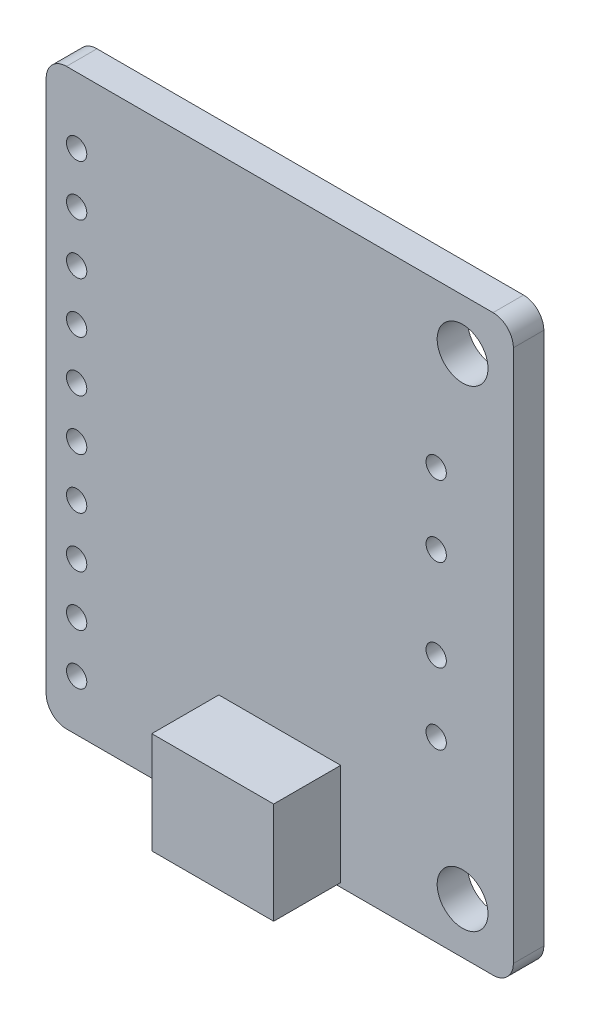
ISO-10303-21;
HEADER;
FILE_DESCRIPTION(('STEP AP214'),'2;1');
FILE_NAME('part.step','',(''),(''),'','','');
FILE_SCHEMA(('AUTOMOTIVE_DESIGN { 1 0 10303 214 1 1 1 1 }'));
ENDSEC;
DATA;
#1=APPLICATION_CONTEXT('core data for automotive mechanical design processes');
#2=APPLICATION_PROTOCOL_DEFINITION('international standard','automotive_design',2000,#1);
#3=PRODUCT_CONTEXT('',#1,'mechanical');
#4=PRODUCT('Part','Part','',(#3));
#5=PRODUCT_RELATED_PRODUCT_CATEGORY('part','',(#4));
#6=PRODUCT_DEFINITION_FORMATION('','',#4);
#7=PRODUCT_DEFINITION_CONTEXT('part definition',#1,'design');
#8=PRODUCT_DEFINITION('design','',#6,#7);
#9=PRODUCT_DEFINITION_SHAPE('','',#8);
#10=(LENGTH_UNIT() NAMED_UNIT(*) SI_UNIT(.MILLI.,.METRE.));
#11=(NAMED_UNIT(*) PLANE_ANGLE_UNIT() SI_UNIT($,.RADIAN.));
#12=(NAMED_UNIT(*) SI_UNIT($,.STERADIAN.) SOLID_ANGLE_UNIT());
#13=UNCERTAINTY_MEASURE_WITH_UNIT(LENGTH_MEASURE(1.E-05),#10,'distance_accuracy_value','');
#14=(GEOMETRIC_REPRESENTATION_CONTEXT(3) GLOBAL_UNCERTAINTY_ASSIGNED_CONTEXT((#13)) GLOBAL_UNIT_ASSIGNED_CONTEXT((#10,
#11,#12)) REPRESENTATION_CONTEXT('',''));
#15=CARTESIAN_POINT('',(0.,0.,0.));
#16=DIRECTION('',(0.,0.,1.));
#17=DIRECTION('',(1.,0.,0.));
#18=AXIS2_PLACEMENT_3D('',#15,#16,#17);
#19=CARTESIAN_POINT('',(-10.5,-13.125,1.5));
#20=DIRECTION('',(0.,0.,-1.));
#21=DIRECTION('',(-1.,0.,0.));
#22=AXIS2_PLACEMENT_3D('',#19,#20,#21);
#23=PLANE('',#22);
#24=CARTESIAN_POINT('',(7.7,2.625,1.5));
#25=DIRECTION('',(0.,0.,1.));
#26=DIRECTION('',(1.,0.,0.));
#27=AXIS2_PLACEMENT_3D('',#24,#25,#26);
#28=CIRCLE('',#27,0.500000000000001);
#29=CARTESIAN_POINT('',(8.2,2.625,1.5));
#30=VERTEX_POINT('',#29);
#31=EDGE_CURVE('E342',#30,#30,#28,.T.);
#32=ORIENTED_EDGE('',*,*,#31,.F.);
#33=EDGE_LOOP('',(#32));
#34=FACE_BOUND('',#33,.T.);
#35=CARTESIAN_POINT('',(7.7,-5.375,1.5));
#36=DIRECTION('',(0.,0.,1.));
#37=DIRECTION('',(1.,0.,0.));
#38=AXIS2_PLACEMENT_3D('',#35,#36,#37);
#39=CIRCLE('',#38,0.500000000000001);
#40=CARTESIAN_POINT('',(8.2,-5.375,1.5));
#41=VERTEX_POINT('',#40);
#42=EDGE_CURVE('E336',#41,#41,#39,.T.);
#43=ORIENTED_EDGE('',*,*,#42,.F.);
#44=EDGE_LOOP('',(#43));
#45=FACE_BOUND('',#44,.T.);
#46=CARTESIAN_POINT('',(7.7,-1.875,1.5));
#47=DIRECTION('',(0.,0.,1.));
#48=DIRECTION('',(1.,0.,0.));
#49=AXIS2_PLACEMENT_3D('',#46,#47,#48);
#50=CIRCLE('',#49,0.500000000000001);
#51=CARTESIAN_POINT('',(8.2,-1.875,1.5));
#52=VERTEX_POINT('',#51);
#53=EDGE_CURVE('E330',#52,#52,#50,.T.);
#54=ORIENTED_EDGE('',*,*,#53,.F.);
#55=EDGE_LOOP('',(#54));
#56=FACE_BOUND('',#55,.T.);
#57=CARTESIAN_POINT('',(7.7,6.125,1.5));
#58=DIRECTION('',(0.,0.,1.));
#59=DIRECTION('',(1.,0.,0.));
#60=AXIS2_PLACEMENT_3D('',#57,#58,#59);
#61=CIRCLE('',#60,0.500000000000001);
#62=CARTESIAN_POINT('',(8.2,6.125,1.5));
#63=VERTEX_POINT('',#62);
#64=EDGE_CURVE('E324',#63,#63,#61,.T.);
#65=ORIENTED_EDGE('',*,*,#64,.F.);
#66=EDGE_LOOP('',(#65));
#67=FACE_BOUND('',#66,.T.);
#68=CARTESIAN_POINT('',(-10.,10.875,1.5));
#69=DIRECTION('',(0.,0.,1.));
#70=DIRECTION('',(1.,0.,0.));
#71=AXIS2_PLACEMENT_3D('',#68,#69,#70);
#72=CIRCLE('',#71,0.500000000000001);
#73=CARTESIAN_POINT('',(-9.5,10.875,1.5));
#74=VERTEX_POINT('',#73);
#75=EDGE_CURVE('E11',#74,#74,#72,.T.);
#76=ORIENTED_EDGE('',*,*,#75,.F.);
#77=EDGE_LOOP('',(#76));
#78=FACE_BOUND('',#77,.T.);
#79=CARTESIAN_POINT('',(-10.,8.375,1.5));
#80=DIRECTION('',(0.,0.,1.));
#81=DIRECTION('',(1.,0.,0.));
#82=AXIS2_PLACEMENT_3D('',#79,#80,#81);
#83=CIRCLE('',#82,0.500000000000001);
#84=CARTESIAN_POINT('',(-9.5,8.375,1.5));
#85=VERTEX_POINT('',#84);
#86=EDGE_CURVE('E269',#85,#85,#83,.T.);
#87=ORIENTED_EDGE('',*,*,#86,.F.);
#88=EDGE_LOOP('',(#87));
#89=FACE_BOUND('',#88,.T.);
#90=CARTESIAN_POINT('',(-10.,5.875,1.5));
#91=DIRECTION('',(0.,0.,1.));
#92=DIRECTION('',(1.,0.,0.));
#93=AXIS2_PLACEMENT_3D('',#90,#91,#92);
#94=CIRCLE('',#93,0.500000000000001);
#95=CARTESIAN_POINT('',(-9.5,5.875,1.5));
#96=VERTEX_POINT('',#95);
#97=EDGE_CURVE('E263',#96,#96,#94,.T.);
#98=ORIENTED_EDGE('',*,*,#97,.F.);
#99=EDGE_LOOP('',(#98));
#100=FACE_BOUND('',#99,.T.);
#101=CARTESIAN_POINT('',(-10.,3.375,1.5));
#102=DIRECTION('',(0.,0.,1.));
#103=DIRECTION('',(1.,0.,0.));
#104=AXIS2_PLACEMENT_3D('',#101,#102,#103);
#105=CIRCLE('',#104,0.500000000000001);
#106=CARTESIAN_POINT('',(-9.5,3.375,1.5));
#107=VERTEX_POINT('',#106);
#108=EDGE_CURVE('E257',#107,#107,#105,.T.);
#109=ORIENTED_EDGE('',*,*,#108,.F.);
#110=EDGE_LOOP('',(#109));
#111=FACE_BOUND('',#110,.T.);
#112=CARTESIAN_POINT('',(-10.,0.875000000000001,1.5));
#113=DIRECTION('',(0.,0.,1.));
#114=DIRECTION('',(1.,0.,0.));
#115=AXIS2_PLACEMENT_3D('',#112,#113,#114);
#116=CIRCLE('',#115,0.500000000000001);
#117=CARTESIAN_POINT('',(-9.5,0.875000000000001,1.5));
#118=VERTEX_POINT('',#117);
#119=EDGE_CURVE('E251',#118,#118,#116,.T.);
#120=ORIENTED_EDGE('',*,*,#119,.F.);
#121=EDGE_LOOP('',(#120));
#122=FACE_BOUND('',#121,.T.);
#123=CARTESIAN_POINT('',(-10.,-1.625,1.5));
#124=DIRECTION('',(0.,0.,1.));
#125=DIRECTION('',(1.,0.,0.));
#126=AXIS2_PLACEMENT_3D('',#123,#124,#125);
#127=CIRCLE('',#126,0.500000000000001);
#128=CARTESIAN_POINT('',(-9.5,-1.625,1.5));
#129=VERTEX_POINT('',#128);
#130=EDGE_CURVE('E245',#129,#129,#127,.T.);
#131=ORIENTED_EDGE('',*,*,#130,.F.);
#132=EDGE_LOOP('',(#131));
#133=FACE_BOUND('',#132,.T.);
#134=CARTESIAN_POINT('',(-10.,-4.125,1.5));
#135=DIRECTION('',(0.,0.,1.));
#136=DIRECTION('',(1.,0.,0.));
#137=AXIS2_PLACEMENT_3D('',#134,#135,#136);
#138=CIRCLE('',#137,0.500000000000001);
#139=CARTESIAN_POINT('',(-9.5,-4.125,1.5));
#140=VERTEX_POINT('',#139);
#141=EDGE_CURVE('E239',#140,#140,#138,.T.);
#142=ORIENTED_EDGE('',*,*,#141,.F.);
#143=EDGE_LOOP('',(#142));
#144=FACE_BOUND('',#143,.T.);
#145=CARTESIAN_POINT('',(-10.,-6.625,1.5));
#146=DIRECTION('',(0.,0.,1.));
#147=DIRECTION('',(1.,0.,0.));
#148=AXIS2_PLACEMENT_3D('',#145,#146,#147);
#149=CIRCLE('',#148,0.500000000000001);
#150=CARTESIAN_POINT('',(-9.5,-6.625,1.5));
#151=VERTEX_POINT('',#150);
#152=EDGE_CURVE('E233',#151,#151,#149,.T.);
#153=ORIENTED_EDGE('',*,*,#152,.F.);
#154=EDGE_LOOP('',(#153));
#155=FACE_BOUND('',#154,.T.);
#156=CARTESIAN_POINT('',(-10.5,-13.125,1.5));
#157=DIRECTION('',(0.,0.,1.));
#158=DIRECTION('',(-1.,0.,0.));
#159=AXIS2_PLACEMENT_3D('',#156,#157,#158);
#160=CIRCLE('',#159,1.);
#161=CARTESIAN_POINT('',(-11.5,-13.125,1.5));
#162=VERTEX_POINT('',#161);
#163=CARTESIAN_POINT('',(-10.5,-14.125,1.5));
#164=VERTEX_POINT('',#163);
#165=EDGE_CURVE('E173',#162,#164,#160,.T.);
#166=ORIENTED_EDGE('',*,*,#165,.T.);
#167=DIRECTION('',(1.,0.,0.));
#168=VECTOR('',#167,1.);
#169=CARTESIAN_POINT('',(-10.5,-14.125,1.5));
#170=LINE('',#169,#168);
#171=CARTESIAN_POINT('',(10.5,-14.125,1.5));
#172=VERTEX_POINT('',#171);
#173=EDGE_CURVE('E176',#164,#172,#170,.T.);
#174=ORIENTED_EDGE('',*,*,#173,.T.);
#175=CARTESIAN_POINT('',(10.5,-13.125,1.5));
#176=DIRECTION('',(0.,0.,1.));
#177=DIRECTION('',(1.,0.,0.));
#178=AXIS2_PLACEMENT_3D('',#175,#176,#177);
#179=CIRCLE('',#178,1.);
#180=CARTESIAN_POINT('',(11.5,-13.125,1.5));
#181=VERTEX_POINT('',#180);
#182=EDGE_CURVE('E179',#172,#181,#179,.T.);
#183=ORIENTED_EDGE('',*,*,#182,.T.);
#184=DIRECTION('',(0.,1.,0.));
#185=VECTOR('',#184,1.);
#186=CARTESIAN_POINT('',(11.5,-13.125,1.5));
#187=LINE('',#186,#185);
#188=CARTESIAN_POINT('',(11.5,13.125,1.5));
#189=VERTEX_POINT('',#188);
#190=EDGE_CURVE('E181',#181,#189,#187,.T.);
#191=ORIENTED_EDGE('',*,*,#190,.T.);
#192=CARTESIAN_POINT('',(10.5,13.125,1.5));
#193=DIRECTION('',(0.,0.,1.));
#194=DIRECTION('',(-1.,0.,0.));
#195=AXIS2_PLACEMENT_3D('',#192,#193,#194);
#196=CIRCLE('',#195,1.);
#197=CARTESIAN_POINT('',(10.5,14.125,1.5));
#198=VERTEX_POINT('',#197);
#199=EDGE_CURVE('E183',#189,#198,#196,.T.);
#200=ORIENTED_EDGE('',*,*,#199,.T.);
#201=DIRECTION('',(-1.,0.,0.));
#202=VECTOR('',#201,1.);
#203=CARTESIAN_POINT('',(-10.5,14.125,1.5));
#204=LINE('',#203,#202);
#205=CARTESIAN_POINT('',(-10.5,14.125,1.5));
#206=VERTEX_POINT('',#205);
#207=EDGE_CURVE('E185',#198,#206,#204,.T.);
#208=ORIENTED_EDGE('',*,*,#207,.T.);
#209=CARTESIAN_POINT('',(-10.5,13.125,1.5));
#210=DIRECTION('',(0.,0.,1.));
#211=DIRECTION('',(-1.,0.,0.));
#212=AXIS2_PLACEMENT_3D('',#209,#210,#211);
#213=CIRCLE('',#212,1.);
#214=CARTESIAN_POINT('',(-11.5,13.125,1.5));
#215=VERTEX_POINT('',#214);
#216=EDGE_CURVE('E187',#206,#215,#213,.T.);
#217=ORIENTED_EDGE('',*,*,#216,.T.);
#218=DIRECTION('',(0.,-1.,0.));
#219=VECTOR('',#218,1.);
#220=CARTESIAN_POINT('',(-11.5,-13.125,1.5));
#221=LINE('',#220,#219);
#222=EDGE_CURVE('E189',#215,#162,#221,.T.);
#223=ORIENTED_EDGE('',*,*,#222,.T.);
#224=EDGE_LOOP('',(#166,#174,#183,#191,#200,#208,#217,#223));
#225=FACE_BOUND('',#224,.T.);
#226=CARTESIAN_POINT('',(9.,11.625,1.5));
#227=DIRECTION('',(0.,0.,1.));
#228=DIRECTION('',(1.,0.,0.));
#229=AXIS2_PLACEMENT_3D('',#226,#227,#228);
#230=CIRCLE('',#229,1.25);
#231=CARTESIAN_POINT('',(10.25,11.625,1.5));
#232=VERTEX_POINT('',#231);
#233=EDGE_CURVE('E164',#232,#232,#230,.T.);
#234=ORIENTED_EDGE('',*,*,#233,.F.);
#235=EDGE_LOOP('',(#234));
#236=FACE_BOUND('',#235,.T.);
#237=CARTESIAN_POINT('',(9.,-11.625,1.5));
#238=DIRECTION('',(0.,0.,-1.));
#239=DIRECTION('',(1.,0.,0.));
#240=AXIS2_PLACEMENT_3D('',#237,#238,#239);
#241=CIRCLE('',#240,1.25);
#242=CARTESIAN_POINT('',(10.25,-11.625,1.5));
#243=VERTEX_POINT('',#242);
#244=EDGE_CURVE('E158',#243,#243,#241,.T.);
#245=ORIENTED_EDGE('',*,*,#244,.T.);
#246=EDGE_LOOP('',(#245));
#247=FACE_BOUND('',#246,.T.);
#248=CARTESIAN_POINT('',(-10.,-11.625,1.5));
#249=DIRECTION('',(0.,0.,1.));
#250=DIRECTION('',(1.,0.,0.));
#251=AXIS2_PLACEMENT_3D('',#248,#249,#250);
#252=CIRCLE('',#251,0.500000000000001);
#253=CARTESIAN_POINT('',(-9.5,-11.625,1.5));
#254=VERTEX_POINT('',#253);
#255=EDGE_CURVE('E154',#254,#254,#252,.T.);
#256=ORIENTED_EDGE('',*,*,#255,.F.);
#257=EDGE_LOOP('',(#256));
#258=FACE_BOUND('',#257,.T.);
#259=CARTESIAN_POINT('',(-10.,-9.125,1.5));
#260=DIRECTION('',(0.,0.,1.));
#261=DIRECTION('',(1.,0.,0.));
#262=AXIS2_PLACEMENT_3D('',#259,#260,#261);
#263=CIRCLE('',#262,0.500000000000001);
#264=CARTESIAN_POINT('',(-9.5,-9.125,1.5));
#265=VERTEX_POINT('',#264);
#266=EDGE_CURVE('E146',#265,#265,#263,.T.);
#267=ORIENTED_EDGE('',*,*,#266,.F.);
#268=EDGE_LOOP('',(#267));
#269=FACE_BOUND('',#268,.T.);
#270=DIRECTION('',(0.,1.,0.));
#271=VECTOR('',#270,1.);
#272=CARTESIAN_POINT('',(3.,-8.925,1.5));
#273=LINE('',#272,#271);
#274=CARTESIAN_POINT('',(3.,-13.925,1.5));
#275=VERTEX_POINT('',#274);
#276=CARTESIAN_POINT('',(3.,-8.925,1.5));
#277=VERTEX_POINT('',#276);
#278=EDGE_CURVE('E142',#275,#277,#273,.T.);
#279=ORIENTED_EDGE('',*,*,#278,.F.);
#280=DIRECTION('',(1.,0.,0.));
#281=VECTOR('',#280,1.);
#282=CARTESIAN_POINT('',(-3.,-13.925,1.5));
#283=LINE('',#282,#281);
#284=CARTESIAN_POINT('',(-3.,-13.925,1.5));
#285=VERTEX_POINT('',#284);
#286=EDGE_CURVE('E139',#285,#275,#283,.T.);
#287=ORIENTED_EDGE('',*,*,#286,.F.);
#288=DIRECTION('',(0.,-1.,0.));
#289=VECTOR('',#288,1.);
#290=CARTESIAN_POINT('',(-3.,-8.925,1.5));
#291=LINE('',#290,#289);
#292=CARTESIAN_POINT('',(-3.,-8.925,1.5));
#293=VERTEX_POINT('',#292);
#294=EDGE_CURVE('E53',#293,#285,#291,.T.);
#295=ORIENTED_EDGE('',*,*,#294,.F.);
#296=DIRECTION('',(-1.,0.,0.));
#297=VECTOR('',#296,1.);
#298=CARTESIAN_POINT('',(-3.,-8.925,1.5));
#299=LINE('',#298,#297);
#300=EDGE_CURVE('E48',#277,#293,#299,.T.);
#301=ORIENTED_EDGE('',*,*,#300,.F.);
#302=EDGE_LOOP('',(#279,#287,#295,#301));
#303=FACE_BOUND('',#302,.T.);
#304=ADVANCED_FACE('F33',(#34,#45,#56,#67,#78,#89,#100,#111,#122,#133,#144,#155,#225,#236,#247,
#258,#269,#303),#23,.F.);
#305=CARTESIAN_POINT('',(-10.,10.875,0.));
#306=DIRECTION('',(0.,0.,1.));
#307=DIRECTION('',(1.,0.,0.));
#308=AXIS2_PLACEMENT_3D('',#305,#306,#307);
#309=CYLINDRICAL_SURFACE('',#308,0.500000000000001);
#310=CARTESIAN_POINT('',(-10.,10.875,0.));
#311=DIRECTION('',(0.,0.,1.));
#312=DIRECTION('',(1.,0.,0.));
#313=AXIS2_PLACEMENT_3D('',#310,#311,#312);
#314=CIRCLE('',#313,0.500000000000001);
#315=CARTESIAN_POINT('',(-9.5,10.875,0.));
#316=VERTEX_POINT('',#315);
#317=EDGE_CURVE('E41',#316,#316,#314,.T.);
#318=ORIENTED_EDGE('',*,*,#317,.F.);
#319=EDGE_LOOP('',(#318));
#320=FACE_BOUND('',#319,.T.);
#321=ORIENTED_EDGE('',*,*,#75,.T.);
#322=EDGE_LOOP('',(#321));
#323=FACE_BOUND('',#322,.T.);
#324=ADVANCED_FACE('F35',(#320,#323),#309,.F.);
#325=CARTESIAN_POINT('',(-10.,8.375,0.));
#326=DIRECTION('',(0.,0.,1.));
#327=DIRECTION('',(1.,0.,0.));
#328=AXIS2_PLACEMENT_3D('',#325,#326,#327);
#329=CYLINDRICAL_SURFACE('',#328,0.500000000000001);
#330=CARTESIAN_POINT('',(-10.,8.375,0.));
#331=DIRECTION('',(0.,0.,1.));
#332=DIRECTION('',(1.,0.,0.));
#333=AXIS2_PLACEMENT_3D('',#330,#331,#332);
#334=CIRCLE('',#333,0.500000000000001);
#335=CARTESIAN_POINT('',(-9.5,8.375,0.));
#336=VERTEX_POINT('',#335);
#337=EDGE_CURVE('E266',#336,#336,#334,.T.);
#338=ORIENTED_EDGE('',*,*,#337,.F.);
#339=EDGE_LOOP('',(#338));
#340=FACE_BOUND('',#339,.T.);
#341=ORIENTED_EDGE('',*,*,#86,.T.);
#342=EDGE_LOOP('',(#341));
#343=FACE_BOUND('',#342,.T.);
#344=ADVANCED_FACE('F278',(#340,#343),#329,.F.);
#345=CARTESIAN_POINT('',(-10.,5.875,0.));
#346=DIRECTION('',(0.,0.,1.));
#347=DIRECTION('',(1.,0.,0.));
#348=AXIS2_PLACEMENT_3D('',#345,#346,#347);
#349=CYLINDRICAL_SURFACE('',#348,0.500000000000001);
#350=CARTESIAN_POINT('',(-10.,5.875,0.));
#351=DIRECTION('',(0.,0.,1.));
#352=DIRECTION('',(1.,0.,0.));
#353=AXIS2_PLACEMENT_3D('',#350,#351,#352);
#354=CIRCLE('',#353,0.500000000000001);
#355=CARTESIAN_POINT('',(-9.5,5.875,0.));
#356=VERTEX_POINT('',#355);
#357=EDGE_CURVE('E260',#356,#356,#354,.T.);
#358=ORIENTED_EDGE('',*,*,#357,.F.);
#359=EDGE_LOOP('',(#358));
#360=FACE_BOUND('',#359,.T.);
#361=ORIENTED_EDGE('',*,*,#97,.T.);
#362=EDGE_LOOP('',(#361));
#363=FACE_BOUND('',#362,.T.);
#364=ADVANCED_FACE('F457',(#360,#363),#349,.F.);
#365=CARTESIAN_POINT('',(-10.,3.375,0.));
#366=DIRECTION('',(0.,0.,1.));
#367=DIRECTION('',(1.,0.,0.));
#368=AXIS2_PLACEMENT_3D('',#365,#366,#367);
#369=CYLINDRICAL_SURFACE('',#368,0.500000000000001);
#370=CARTESIAN_POINT('',(-10.,3.375,0.));
#371=DIRECTION('',(0.,0.,1.));
#372=DIRECTION('',(1.,0.,0.));
#373=AXIS2_PLACEMENT_3D('',#370,#371,#372);
#374=CIRCLE('',#373,0.500000000000001);
#375=CARTESIAN_POINT('',(-9.5,3.375,0.));
#376=VERTEX_POINT('',#375);
#377=EDGE_CURVE('E254',#376,#376,#374,.T.);
#378=ORIENTED_EDGE('',*,*,#377,.F.);
#379=EDGE_LOOP('',(#378));
#380=FACE_BOUND('',#379,.T.);
#381=ORIENTED_EDGE('',*,*,#108,.T.);
#382=EDGE_LOOP('',(#381));
#383=FACE_BOUND('',#382,.T.);
#384=ADVANCED_FACE('F453',(#380,#383),#369,.F.);
#385=CARTESIAN_POINT('',(-10.,0.875000000000001,0.));
#386=DIRECTION('',(0.,0.,1.));
#387=DIRECTION('',(1.,0.,0.));
#388=AXIS2_PLACEMENT_3D('',#385,#386,#387);
#389=CYLINDRICAL_SURFACE('',#388,0.500000000000001);
#390=CARTESIAN_POINT('',(-10.,0.875000000000001,0.));
#391=DIRECTION('',(0.,0.,1.));
#392=DIRECTION('',(1.,0.,0.));
#393=AXIS2_PLACEMENT_3D('',#390,#391,#392);
#394=CIRCLE('',#393,0.500000000000001);
#395=CARTESIAN_POINT('',(-9.5,0.875000000000001,0.));
#396=VERTEX_POINT('',#395);
#397=EDGE_CURVE('E248',#396,#396,#394,.T.);
#398=ORIENTED_EDGE('',*,*,#397,.F.);
#399=EDGE_LOOP('',(#398));
#400=FACE_BOUND('',#399,.T.);
#401=ORIENTED_EDGE('',*,*,#119,.T.);
#402=EDGE_LOOP('',(#401));
#403=FACE_BOUND('',#402,.T.);
#404=ADVANCED_FACE('F449',(#400,#403),#389,.F.);
#405=CARTESIAN_POINT('',(-10.,-1.625,0.));
#406=DIRECTION('',(0.,0.,1.));
#407=DIRECTION('',(1.,0.,0.));
#408=AXIS2_PLACEMENT_3D('',#405,#406,#407);
#409=CYLINDRICAL_SURFACE('',#408,0.500000000000001);
#410=CARTESIAN_POINT('',(-10.,-1.625,0.));
#411=DIRECTION('',(0.,0.,1.));
#412=DIRECTION('',(1.,0.,0.));
#413=AXIS2_PLACEMENT_3D('',#410,#411,#412);
#414=CIRCLE('',#413,0.500000000000001);
#415=CARTESIAN_POINT('',(-9.5,-1.625,0.));
#416=VERTEX_POINT('',#415);
#417=EDGE_CURVE('E242',#416,#416,#414,.T.);
#418=ORIENTED_EDGE('',*,*,#417,.F.);
#419=EDGE_LOOP('',(#418));
#420=FACE_BOUND('',#419,.T.);
#421=ORIENTED_EDGE('',*,*,#130,.T.);
#422=EDGE_LOOP('',(#421));
#423=FACE_BOUND('',#422,.T.);
#424=ADVANCED_FACE('F445',(#420,#423),#409,.F.);
#425=CARTESIAN_POINT('',(-10.,-4.125,0.));
#426=DIRECTION('',(0.,0.,1.));
#427=DIRECTION('',(1.,0.,0.));
#428=AXIS2_PLACEMENT_3D('',#425,#426,#427);
#429=CYLINDRICAL_SURFACE('',#428,0.500000000000001);
#430=CARTESIAN_POINT('',(-10.,-4.125,0.));
#431=DIRECTION('',(0.,0.,1.));
#432=DIRECTION('',(1.,0.,0.));
#433=AXIS2_PLACEMENT_3D('',#430,#431,#432);
#434=CIRCLE('',#433,0.500000000000001);
#435=CARTESIAN_POINT('',(-9.5,-4.125,0.));
#436=VERTEX_POINT('',#435);
#437=EDGE_CURVE('E236',#436,#436,#434,.T.);
#438=ORIENTED_EDGE('',*,*,#437,.F.);
#439=EDGE_LOOP('',(#438));
#440=FACE_BOUND('',#439,.T.);
#441=ORIENTED_EDGE('',*,*,#141,.T.);
#442=EDGE_LOOP('',(#441));
#443=FACE_BOUND('',#442,.T.);
#444=ADVANCED_FACE('F441',(#440,#443),#429,.F.);
#445=CARTESIAN_POINT('',(-10.,-6.625,0.));
#446=DIRECTION('',(0.,0.,1.));
#447=DIRECTION('',(1.,0.,0.));
#448=AXIS2_PLACEMENT_3D('',#445,#446,#447);
#449=CYLINDRICAL_SURFACE('',#448,0.500000000000001);
#450=CARTESIAN_POINT('',(-10.,-6.625,0.));
#451=DIRECTION('',(0.,0.,1.));
#452=DIRECTION('',(1.,0.,0.));
#453=AXIS2_PLACEMENT_3D('',#450,#451,#452);
#454=CIRCLE('',#453,0.500000000000001);
#455=CARTESIAN_POINT('',(-9.5,-6.625,0.));
#456=VERTEX_POINT('',#455);
#457=EDGE_CURVE('E230',#456,#456,#454,.T.);
#458=ORIENTED_EDGE('',*,*,#457,.F.);
#459=EDGE_LOOP('',(#458));
#460=FACE_BOUND('',#459,.T.);
#461=ORIENTED_EDGE('',*,*,#152,.T.);
#462=EDGE_LOOP('',(#461));
#463=FACE_BOUND('',#462,.T.);
#464=ADVANCED_FACE('F437',(#460,#463),#449,.F.);
#465=CARTESIAN_POINT('',(-10.5,-13.125,1.5));
#466=DIRECTION('',(0.,0.,-1.));
#467=DIRECTION('',(-1.,0.,0.));
#468=AXIS2_PLACEMENT_3D('',#465,#466,#467);
#469=CYLINDRICAL_SURFACE('',#468,1.);
#470=CARTESIAN_POINT('',(-10.5,-13.125,0.));
#471=DIRECTION('',(0.,0.,1.));
#472=DIRECTION('',(-1.,0.,0.));
#473=AXIS2_PLACEMENT_3D('',#470,#471,#472);
#474=CIRCLE('',#473,1.);
#475=CARTESIAN_POINT('',(-11.5,-13.125,0.));
#476=VERTEX_POINT('',#475);
#477=CARTESIAN_POINT('',(-10.5,-14.125,0.));
#478=VERTEX_POINT('',#477);
#479=EDGE_CURVE('E170',#476,#478,#474,.T.);
#480=ORIENTED_EDGE('',*,*,#479,.T.);
#481=DIRECTION('',(0.,0.,-1.));
#482=VECTOR('',#481,1.);
#483=CARTESIAN_POINT('',(-10.5,-14.125,1.5));
#484=LINE('',#483,#482);
#485=EDGE_CURVE('E227',#164,#478,#484,.T.);
#486=ORIENTED_EDGE('',*,*,#485,.F.);
#487=ORIENTED_EDGE('',*,*,#165,.F.);
#488=DIRECTION('',(0.,0.,-1.));
#489=VECTOR('',#488,1.);
#490=CARTESIAN_POINT('',(-11.5,-13.125,1.5));
#491=LINE('',#490,#489);
#492=EDGE_CURVE('E191',#162,#476,#491,.T.);
#493=ORIENTED_EDGE('',*,*,#492,.T.);
#494=EDGE_LOOP('',(#480,#486,#487,#493));
#495=FACE_BOUND('',#494,.T.);
#496=ADVANCED_FACE('F433',(#495),#469,.T.);
#497=CARTESIAN_POINT('',(-10.5,-14.125,1.5));
#498=DIRECTION('',(0.,1.,0.));
#499=DIRECTION('',(0.,0.,1.));
#500=AXIS2_PLACEMENT_3D('',#497,#498,#499);
#501=PLANE('',#500);
#502=DIRECTION('',(1.,0.,0.));
#503=VECTOR('',#502,1.);
#504=CARTESIAN_POINT('',(-10.5,-14.125,0.));
#505=LINE('',#504,#503);
#506=CARTESIAN_POINT('',(10.5,-14.125,0.));
#507=VERTEX_POINT('',#506);
#508=EDGE_CURVE('E194',#478,#507,#505,.T.);
#509=ORIENTED_EDGE('',*,*,#508,.T.);
#510=DIRECTION('',(0.,0.,-1.));
#511=VECTOR('',#510,1.);
#512=CARTESIAN_POINT('',(10.5,-14.125,1.5));
#513=LINE('',#512,#511);
#514=EDGE_CURVE('E224',#172,#507,#513,.T.);
#515=ORIENTED_EDGE('',*,*,#514,.F.);
#516=ORIENTED_EDGE('',*,*,#173,.F.);
#517=ORIENTED_EDGE('',*,*,#485,.T.);
#518=EDGE_LOOP('',(#509,#515,#516,#517));
#519=FACE_BOUND('',#518,.T.);
#520=ADVANCED_FACE('F429',(#519),#501,.F.);
#521=CARTESIAN_POINT('',(10.5,-13.125,1.5));
#522=DIRECTION('',(0.,0.,-1.));
#523=DIRECTION('',(-1.,0.,0.));
#524=AXIS2_PLACEMENT_3D('',#521,#522,#523);
#525=CYLINDRICAL_SURFACE('',#524,1.);
#526=CARTESIAN_POINT('',(10.5,-13.125,0.));
#527=DIRECTION('',(0.,0.,1.));
#528=DIRECTION('',(1.,0.,0.));
#529=AXIS2_PLACEMENT_3D('',#526,#527,#528);
#530=CIRCLE('',#529,1.);
#531=CARTESIAN_POINT('',(11.5,-13.125,0.));
#532=VERTEX_POINT('',#531);
#533=EDGE_CURVE('E196',#507,#532,#530,.T.);
#534=ORIENTED_EDGE('',*,*,#533,.T.);
#535=DIRECTION('',(0.,0.,-1.));
#536=VECTOR('',#535,1.);
#537=CARTESIAN_POINT('',(11.5,-13.125,1.5));
#538=LINE('',#537,#536);
#539=EDGE_CURVE('E221',#181,#532,#538,.T.);
#540=ORIENTED_EDGE('',*,*,#539,.F.);
#541=ORIENTED_EDGE('',*,*,#182,.F.);
#542=ORIENTED_EDGE('',*,*,#514,.T.);
#543=EDGE_LOOP('',(#534,#540,#541,#542));
#544=FACE_BOUND('',#543,.T.);
#545=ADVANCED_FACE('F425',(#544),#525,.T.);
#546=CARTESIAN_POINT('',(11.5,-13.125,1.5));
#547=DIRECTION('',(-1.,0.,0.));
#548=DIRECTION('',(0.,0.,1.));
#549=AXIS2_PLACEMENT_3D('',#546,#547,#548);
#550=PLANE('',#549);
#551=DIRECTION('',(0.,1.,0.));
#552=VECTOR('',#551,1.);
#553=CARTESIAN_POINT('',(11.5,-13.125,0.));
#554=LINE('',#553,#552);
#555=CARTESIAN_POINT('',(11.5,13.125,0.));
#556=VERTEX_POINT('',#555);
#557=EDGE_CURVE('E198',#532,#556,#554,.T.);
#558=ORIENTED_EDGE('',*,*,#557,.T.);
#559=DIRECTION('',(0.,0.,-1.));
#560=VECTOR('',#559,1.);
#561=CARTESIAN_POINT('',(11.5,13.125,1.5));
#562=LINE('',#561,#560);
#563=EDGE_CURVE('E218',#189,#556,#562,.T.);
#564=ORIENTED_EDGE('',*,*,#563,.F.);
#565=ORIENTED_EDGE('',*,*,#190,.F.);
#566=ORIENTED_EDGE('',*,*,#539,.T.);
#567=EDGE_LOOP('',(#558,#564,#565,#566));
#568=FACE_BOUND('',#567,.T.);
#569=ADVANCED_FACE('F421',(#568),#550,.F.);
#570=CARTESIAN_POINT('',(10.5,13.125,1.5));
#571=DIRECTION('',(0.,0.,-1.));
#572=DIRECTION('',(-1.,0.,0.));
#573=AXIS2_PLACEMENT_3D('',#570,#571,#572);
#574=CYLINDRICAL_SURFACE('',#573,1.);
#575=CARTESIAN_POINT('',(10.5,13.125,0.));
#576=DIRECTION('',(0.,0.,1.));
#577=DIRECTION('',(-1.,0.,0.));
#578=AXIS2_PLACEMENT_3D('',#575,#576,#577);
#579=CIRCLE('',#578,1.);
#580=CARTESIAN_POINT('',(10.5,14.125,0.));
#581=VERTEX_POINT('',#580);
#582=EDGE_CURVE('E200',#556,#581,#579,.T.);
#583=ORIENTED_EDGE('',*,*,#582,.T.);
#584=DIRECTION('',(0.,0.,-1.));
#585=VECTOR('',#584,1.);
#586=CARTESIAN_POINT('',(10.5,14.125,1.5));
#587=LINE('',#586,#585);
#588=EDGE_CURVE('E215',#198,#581,#587,.T.);
#589=ORIENTED_EDGE('',*,*,#588,.F.);
#590=ORIENTED_EDGE('',*,*,#199,.F.);
#591=ORIENTED_EDGE('',*,*,#563,.T.);
#592=EDGE_LOOP('',(#583,#589,#590,#591));
#593=FACE_BOUND('',#592,.T.);
#594=ADVANCED_FACE('F417',(#593),#574,.T.);
#595=CARTESIAN_POINT('',(-10.5,14.125,1.5));
#596=DIRECTION('',(0.,-1.,0.));
#597=DIRECTION('',(0.,0.,-1.));
#598=AXIS2_PLACEMENT_3D('',#595,#596,#597);
#599=PLANE('',#598);
#600=DIRECTION('',(-1.,0.,0.));
#601=VECTOR('',#600,1.);
#602=CARTESIAN_POINT('',(-10.5,14.125,0.));
#603=LINE('',#602,#601);
#604=CARTESIAN_POINT('',(-10.5,14.125,0.));
#605=VERTEX_POINT('',#604);
#606=EDGE_CURVE('E202',#581,#605,#603,.T.);
#607=ORIENTED_EDGE('',*,*,#606,.T.);
#608=DIRECTION('',(0.,0.,-1.));
#609=VECTOR('',#608,1.);
#610=CARTESIAN_POINT('',(-10.5,14.125,1.5));
#611=LINE('',#610,#609);
#612=EDGE_CURVE('E212',#206,#605,#611,.T.);
#613=ORIENTED_EDGE('',*,*,#612,.F.);
#614=ORIENTED_EDGE('',*,*,#207,.F.);
#615=ORIENTED_EDGE('',*,*,#588,.T.);
#616=EDGE_LOOP('',(#607,#613,#614,#615));
#617=FACE_BOUND('',#616,.T.);
#618=ADVANCED_FACE('F413',(#617),#599,.F.);
#619=CARTESIAN_POINT('',(-10.5,13.125,1.5));
#620=DIRECTION('',(0.,0.,-1.));
#621=DIRECTION('',(-1.,0.,0.));
#622=AXIS2_PLACEMENT_3D('',#619,#620,#621);
#623=CYLINDRICAL_SURFACE('',#622,1.);
#624=CARTESIAN_POINT('',(-10.5,13.125,0.));
#625=DIRECTION('',(0.,0.,1.));
#626=DIRECTION('',(-1.,0.,0.));
#627=AXIS2_PLACEMENT_3D('',#624,#625,#626);
#628=CIRCLE('',#627,1.);
#629=CARTESIAN_POINT('',(-11.5,13.125,0.));
#630=VERTEX_POINT('',#629);
#631=EDGE_CURVE('E204',#605,#630,#628,.T.);
#632=ORIENTED_EDGE('',*,*,#631,.T.);
#633=DIRECTION('',(0.,0.,-1.));
#634=VECTOR('',#633,1.);
#635=CARTESIAN_POINT('',(-11.5,13.125,1.5));
#636=LINE('',#635,#634);
#637=EDGE_CURVE('E209',#215,#630,#636,.T.);
#638=ORIENTED_EDGE('',*,*,#637,.F.);
#639=ORIENTED_EDGE('',*,*,#216,.F.);
#640=ORIENTED_EDGE('',*,*,#612,.T.);
#641=EDGE_LOOP('',(#632,#638,#639,#640));
#642=FACE_BOUND('',#641,.T.);
#643=ADVANCED_FACE('F409',(#642),#623,.T.);
#644=CARTESIAN_POINT('',(-11.5,-13.125,1.5));
#645=DIRECTION('',(1.,0.,0.));
#646=DIRECTION('',(0.,0.,-1.));
#647=AXIS2_PLACEMENT_3D('',#644,#645,#646);
#648=PLANE('',#647);
#649=DIRECTION('',(0.,-1.,0.));
#650=VECTOR('',#649,1.);
#651=CARTESIAN_POINT('',(-11.5,-13.125,0.));
#652=LINE('',#651,#650);
#653=EDGE_CURVE('E177',#630,#476,#652,.T.);
#654=ORIENTED_EDGE('',*,*,#653,.T.);
#655=ORIENTED_EDGE('',*,*,#492,.F.);
#656=ORIENTED_EDGE('',*,*,#222,.F.);
#657=ORIENTED_EDGE('',*,*,#637,.T.);
#658=EDGE_LOOP('',(#654,#655,#656,#657));
#659=FACE_BOUND('',#658,.T.);
#660=ADVANCED_FACE('F406',(#659),#648,.F.);
#661=CARTESIAN_POINT('',(-10.5,-13.125,0.));
#662=DIRECTION('',(0.,0.,-1.));
#663=DIRECTION('',(-1.,0.,0.));
#664=AXIS2_PLACEMENT_3D('',#661,#662,#663);
#665=PLANE('',#664);
#666=CARTESIAN_POINT('',(7.7,2.625,0.));
#667=DIRECTION('',(0.,0.,1.));
#668=DIRECTION('',(1.,0.,0.));
#669=AXIS2_PLACEMENT_3D('',#666,#667,#668);
#670=CIRCLE('',#669,0.500000000000001);
#671=CARTESIAN_POINT('',(8.2,2.625,0.));
#672=VERTEX_POINT('',#671);
#673=EDGE_CURVE('E333',#672,#672,#670,.T.);
#674=ORIENTED_EDGE('',*,*,#673,.T.);
#675=EDGE_LOOP('',(#674));
#676=FACE_BOUND('',#675,.T.);
#677=CARTESIAN_POINT('',(7.7,-5.375,0.));
#678=DIRECTION('',(0.,0.,1.));
#679=DIRECTION('',(1.,0.,0.));
#680=AXIS2_PLACEMENT_3D('',#677,#678,#679);
#681=CIRCLE('',#680,0.500000000000001);
#682=CARTESIAN_POINT('',(8.2,-5.375,0.));
#683=VERTEX_POINT('',#682);
#684=EDGE_CURVE('E339',#683,#683,#681,.T.);
#685=ORIENTED_EDGE('',*,*,#684,.T.);
#686=EDGE_LOOP('',(#685));
#687=FACE_BOUND('',#686,.T.);
#688=CARTESIAN_POINT('',(7.7,-1.875,0.));
#689=DIRECTION('',(0.,0.,1.));
#690=DIRECTION('',(1.,0.,0.));
#691=AXIS2_PLACEMENT_3D('',#688,#689,#690);
#692=CIRCLE('',#691,0.500000000000001);
#693=CARTESIAN_POINT('',(8.2,-1.875,0.));
#694=VERTEX_POINT('',#693);
#695=EDGE_CURVE('E327',#694,#694,#692,.T.);
#696=ORIENTED_EDGE('',*,*,#695,.T.);
#697=EDGE_LOOP('',(#696));
#698=FACE_BOUND('',#697,.T.);
#699=CARTESIAN_POINT('',(7.7,6.125,0.));
#700=DIRECTION('',(0.,0.,1.));
#701=DIRECTION('',(1.,0.,0.));
#702=AXIS2_PLACEMENT_3D('',#699,#700,#701);
#703=CIRCLE('',#702,0.500000000000001);
#704=CARTESIAN_POINT('',(8.2,6.125,0.));
#705=VERTEX_POINT('',#704);
#706=EDGE_CURVE('E310',#705,#705,#703,.T.);
#707=ORIENTED_EDGE('',*,*,#706,.T.);
#708=EDGE_LOOP('',(#707));
#709=FACE_BOUND('',#708,.T.);
#710=CARTESIAN_POINT('',(-10.,-9.125,0.));
#711=DIRECTION('',(0.,0.,1.));
#712=DIRECTION('',(1.,0.,0.));
#713=AXIS2_PLACEMENT_3D('',#710,#711,#712);
#714=CIRCLE('',#713,0.500000000000001);
#715=CARTESIAN_POINT('',(-9.5,-9.125,0.));
#716=VERTEX_POINT('',#715);
#717=EDGE_CURVE('E143',#716,#716,#714,.T.);
#718=ORIENTED_EDGE('',*,*,#717,.T.);
#719=EDGE_LOOP('',(#718));
#720=FACE_BOUND('',#719,.T.);
#721=CARTESIAN_POINT('',(-10.,-11.625,0.));
#722=DIRECTION('',(0.,0.,1.));
#723=DIRECTION('',(1.,0.,0.));
#724=AXIS2_PLACEMENT_3D('',#721,#722,#723);
#725=CIRCLE('',#724,0.500000000000001);
#726=CARTESIAN_POINT('',(-9.5,-11.625,0.));
#727=VERTEX_POINT('',#726);
#728=EDGE_CURVE('E155',#727,#727,#725,.T.);
#729=ORIENTED_EDGE('',*,*,#728,.T.);
#730=EDGE_LOOP('',(#729));
#731=FACE_BOUND('',#730,.T.);
#732=CARTESIAN_POINT('',(9.,-11.625,0.));
#733=DIRECTION('',(0.,0.,-1.));
#734=DIRECTION('',(1.,0.,0.));
#735=AXIS2_PLACEMENT_3D('',#732,#733,#734);
#736=CIRCLE('',#735,1.25);
#737=CARTESIAN_POINT('',(10.25,-11.625,0.));
#738=VERTEX_POINT('',#737);
#739=EDGE_CURVE('E161',#738,#738,#736,.T.);
#740=ORIENTED_EDGE('',*,*,#739,.F.);
#741=EDGE_LOOP('',(#740));
#742=FACE_BOUND('',#741,.T.);
#743=CARTESIAN_POINT('',(9.,11.625,0.));
#744=DIRECTION('',(0.,0.,1.));
#745=DIRECTION('',(1.,0.,0.));
#746=AXIS2_PLACEMENT_3D('',#743,#744,#745);
#747=CIRCLE('',#746,1.25);
#748=CARTESIAN_POINT('',(10.25,11.625,0.));
#749=VERTEX_POINT('',#748);
#750=EDGE_CURVE('E167',#749,#749,#747,.T.);
#751=ORIENTED_EDGE('',*,*,#750,.T.);
#752=EDGE_LOOP('',(#751));
#753=FACE_BOUND('',#752,.T.);
#754=ORIENTED_EDGE('',*,*,#479,.F.);
#755=ORIENTED_EDGE('',*,*,#653,.F.);
#756=ORIENTED_EDGE('',*,*,#631,.F.);
#757=ORIENTED_EDGE('',*,*,#606,.F.);
#758=ORIENTED_EDGE('',*,*,#582,.F.);
#759=ORIENTED_EDGE('',*,*,#557,.F.);
#760=ORIENTED_EDGE('',*,*,#533,.F.);
#761=ORIENTED_EDGE('',*,*,#508,.F.);
#762=EDGE_LOOP('',(#754,#755,#756,#757,#758,#759,#760,#761));
#763=FACE_BOUND('',#762,.T.);
#764=ORIENTED_EDGE('',*,*,#457,.T.);
#765=EDGE_LOOP('',(#764));
#766=FACE_BOUND('',#765,.T.);
#767=ORIENTED_EDGE('',*,*,#437,.T.);
#768=EDGE_LOOP('',(#767));
#769=FACE_BOUND('',#768,.T.);
#770=ORIENTED_EDGE('',*,*,#417,.T.);
#771=EDGE_LOOP('',(#770));
#772=FACE_BOUND('',#771,.T.);
#773=ORIENTED_EDGE('',*,*,#397,.T.);
#774=EDGE_LOOP('',(#773));
#775=FACE_BOUND('',#774,.T.);
#776=ORIENTED_EDGE('',*,*,#377,.T.);
#777=EDGE_LOOP('',(#776));
#778=FACE_BOUND('',#777,.T.);
#779=ORIENTED_EDGE('',*,*,#357,.T.);
#780=EDGE_LOOP('',(#779));
#781=FACE_BOUND('',#780,.T.);
#782=ORIENTED_EDGE('',*,*,#337,.T.);
#783=EDGE_LOOP('',(#782));
#784=FACE_BOUND('',#783,.T.);
#785=ORIENTED_EDGE('',*,*,#317,.T.);
#786=EDGE_LOOP('',(#785));
#787=FACE_BOUND('',#786,.T.);
#788=ADVANCED_FACE('F274',(#676,#687,#698,#709,#720,#731,#742,#753,#763,#766,#769,#772,#775,
#778,#781,#784,#787),#665,.T.);
#789=CARTESIAN_POINT('',(9.,11.625,0.));
#790=DIRECTION('',(0.,0.,1.));
#791=DIRECTION('',(1.,0.,0.));
#792=AXIS2_PLACEMENT_3D('',#789,#790,#791);
#793=CYLINDRICAL_SURFACE('',#792,1.25);
#794=ORIENTED_EDGE('',*,*,#750,.F.);
#795=EDGE_LOOP('',(#794));
#796=FACE_BOUND('',#795,.T.);
#797=ORIENTED_EDGE('',*,*,#233,.T.);
#798=EDGE_LOOP('',(#797));
#799=FACE_BOUND('',#798,.T.);
#800=ADVANCED_FACE('F399',(#796,#799),#793,.F.);
#801=CARTESIAN_POINT('',(9.,-11.625,0.));
#802=DIRECTION('',(0.,0.,1.));
#803=DIRECTION('',(1.,0.,0.));
#804=AXIS2_PLACEMENT_3D('',#801,#802,#803);
#805=CYLINDRICAL_SURFACE('',#804,1.25);
#806=ORIENTED_EDGE('',*,*,#739,.T.);
#807=EDGE_LOOP('',(#806));
#808=FACE_BOUND('',#807,.T.);
#809=ORIENTED_EDGE('',*,*,#244,.F.);
#810=EDGE_LOOP('',(#809));
#811=FACE_BOUND('',#810,.T.);
#812=ADVANCED_FACE('F395',(#808,#811),#805,.F.);
#813=CARTESIAN_POINT('',(-10.,-11.625,0.));
#814=DIRECTION('',(0.,0.,1.));
#815=DIRECTION('',(1.,0.,0.));
#816=AXIS2_PLACEMENT_3D('',#813,#814,#815);
#817=CYLINDRICAL_SURFACE('',#816,0.500000000000001);
#818=ORIENTED_EDGE('',*,*,#728,.F.);
#819=EDGE_LOOP('',(#818));
#820=FACE_BOUND('',#819,.T.);
#821=ORIENTED_EDGE('',*,*,#255,.T.);
#822=EDGE_LOOP('',(#821));
#823=FACE_BOUND('',#822,.T.);
#824=ADVANCED_FACE('F391',(#820,#823),#817,.F.);
#825=CARTESIAN_POINT('',(-10.,-9.125,0.));
#826=DIRECTION('',(0.,0.,1.));
#827=DIRECTION('',(1.,0.,0.));
#828=AXIS2_PLACEMENT_3D('',#825,#826,#827);
#829=CYLINDRICAL_SURFACE('',#828,0.500000000000001);
#830=ORIENTED_EDGE('',*,*,#717,.F.);
#831=EDGE_LOOP('',(#830));
#832=FACE_BOUND('',#831,.T.);
#833=ORIENTED_EDGE('',*,*,#266,.T.);
#834=EDGE_LOOP('',(#833));
#835=FACE_BOUND('',#834,.T.);
#836=ADVANCED_FACE('F388',(#832,#835),#829,.F.);
#837=CARTESIAN_POINT('',(3.,-8.925,4.8));
#838=DIRECTION('',(-1.,0.,0.));
#839=DIRECTION('',(0.,-1.,0.));
#840=AXIS2_PLACEMENT_3D('',#837,#838,#839);
#841=PLANE('',#840);
#842=ORIENTED_EDGE('',*,*,#278,.T.);
#843=DIRECTION('',(0.,0.,-1.));
#844=VECTOR('',#843,1.);
#845=CARTESIAN_POINT('',(3.,-8.925,4.8));
#846=LINE('',#845,#844);
#847=CARTESIAN_POINT('',(3.,-8.925,4.8));
#848=VERTEX_POINT('',#847);
#849=EDGE_CURVE('E123',#848,#277,#846,.T.);
#850=ORIENTED_EDGE('',*,*,#849,.F.);
#851=DIRECTION('',(0.,1.,0.));
#852=VECTOR('',#851,1.);
#853=CARTESIAN_POINT('',(3.,-8.925,4.8));
#854=LINE('',#853,#852);
#855=CARTESIAN_POINT('',(3.,-13.925,4.8));
#856=VERTEX_POINT('',#855);
#857=EDGE_CURVE('E130',#856,#848,#854,.T.);
#858=ORIENTED_EDGE('',*,*,#857,.F.);
#859=DIRECTION('',(0.,0.,-1.));
#860=VECTOR('',#859,1.);
#861=CARTESIAN_POINT('',(3.,-13.925,4.8));
#862=LINE('',#861,#860);
#863=EDGE_CURVE('E315',#856,#275,#862,.T.);
#864=ORIENTED_EDGE('',*,*,#863,.T.);
#865=EDGE_LOOP('',(#842,#850,#858,#864));
#866=FACE_BOUND('',#865,.T.);
#867=ADVANCED_FACE('F141',(#866),#841,.F.);
#868=CARTESIAN_POINT('',(-3.,-8.925,4.8));
#869=DIRECTION('',(0.,-1.,0.));
#870=DIRECTION('',(0.,0.,-1.));
#871=AXIS2_PLACEMENT_3D('',#868,#869,#870);
#872=PLANE('',#871);
#873=ORIENTED_EDGE('',*,*,#300,.T.);
#874=DIRECTION('',(0.,0.,-1.));
#875=VECTOR('',#874,1.);
#876=CARTESIAN_POINT('',(-3.,-8.925,4.8));
#877=LINE('',#876,#875);
#878=CARTESIAN_POINT('',(-3.,-8.925,4.8));
#879=VERTEX_POINT('',#878);
#880=EDGE_CURVE('E126',#879,#293,#877,.T.);
#881=ORIENTED_EDGE('',*,*,#880,.F.);
#882=DIRECTION('',(-1.,0.,0.));
#883=VECTOR('',#882,1.);
#884=CARTESIAN_POINT('',(-3.,-8.925,4.8));
#885=LINE('',#884,#883);
#886=EDGE_CURVE('E119',#848,#879,#885,.T.);
#887=ORIENTED_EDGE('',*,*,#886,.F.);
#888=ORIENTED_EDGE('',*,*,#849,.T.);
#889=EDGE_LOOP('',(#873,#881,#887,#888));
#890=FACE_BOUND('',#889,.T.);
#891=ADVANCED_FACE('F121',(#890),#872,.F.);
#892=CARTESIAN_POINT('',(-3.,-8.925,4.8));
#893=DIRECTION('',(1.,0.,0.));
#894=DIRECTION('',(0.,0.,-1.));
#895=AXIS2_PLACEMENT_3D('',#892,#893,#894);
#896=PLANE('',#895);
#897=ORIENTED_EDGE('',*,*,#294,.T.);
#898=DIRECTION('',(0.,0.,-1.));
#899=VECTOR('',#898,1.);
#900=CARTESIAN_POINT('',(-3.,-13.925,4.8));
#901=LINE('',#900,#899);
#902=CARTESIAN_POINT('',(-3.,-13.925,4.8));
#903=VERTEX_POINT('',#902);
#904=EDGE_CURVE('E148',#903,#285,#901,.T.);
#905=ORIENTED_EDGE('',*,*,#904,.F.);
#906=DIRECTION('',(0.,-1.,0.));
#907=VECTOR('',#906,1.);
#908=CARTESIAN_POINT('',(-3.,-8.925,4.8));
#909=LINE('',#908,#907);
#910=EDGE_CURVE('E129',#879,#903,#909,.T.);
#911=ORIENTED_EDGE('',*,*,#910,.F.);
#912=ORIENTED_EDGE('',*,*,#880,.T.);
#913=EDGE_LOOP('',(#897,#905,#911,#912));
#914=FACE_BOUND('',#913,.T.);
#915=ADVANCED_FACE('F380',(#914),#896,.F.);
#916=CARTESIAN_POINT('',(-3.,-13.925,4.8));
#917=DIRECTION('',(0.,1.,0.));
#918=DIRECTION('',(0.,0.,1.));
#919=AXIS2_PLACEMENT_3D('',#916,#917,#918);
#920=PLANE('',#919);
#921=ORIENTED_EDGE('',*,*,#286,.T.);
#922=ORIENTED_EDGE('',*,*,#863,.F.);
#923=DIRECTION('',(1.,0.,0.));
#924=VECTOR('',#923,1.);
#925=CARTESIAN_POINT('',(-3.,-13.925,4.8));
#926=LINE('',#925,#924);
#927=EDGE_CURVE('E135',#903,#856,#926,.T.);
#928=ORIENTED_EDGE('',*,*,#927,.F.);
#929=ORIENTED_EDGE('',*,*,#904,.T.);
#930=EDGE_LOOP('',(#921,#922,#928,#929));
#931=FACE_BOUND('',#930,.T.);
#932=ADVANCED_FACE('F314',(#931),#920,.F.);
#933=CARTESIAN_POINT('',(0.,0.,4.8));
#934=DIRECTION('',(0.,0.,1.));
#935=DIRECTION('',(1.,0.,0.));
#936=AXIS2_PLACEMENT_3D('',#933,#934,#935);
#937=PLANE('',#936);
#938=ORIENTED_EDGE('',*,*,#857,.T.);
#939=ORIENTED_EDGE('',*,*,#886,.T.);
#940=ORIENTED_EDGE('',*,*,#910,.T.);
#941=ORIENTED_EDGE('',*,*,#927,.T.);
#942=EDGE_LOOP('',(#938,#939,#940,#941));
#943=FACE_BOUND('',#942,.T.);
#944=ADVANCED_FACE('F133',(#943),#937,.T.);
#945=CARTESIAN_POINT('',(7.7,6.125,0.));
#946=DIRECTION('',(0.,0.,1.));
#947=DIRECTION('',(1.,0.,0.));
#948=AXIS2_PLACEMENT_3D('',#945,#946,#947);
#949=CYLINDRICAL_SURFACE('',#948,0.500000000000001);
#950=ORIENTED_EDGE('',*,*,#706,.F.);
#951=EDGE_LOOP('',(#950));
#952=FACE_BOUND('',#951,.T.);
#953=ORIENTED_EDGE('',*,*,#64,.T.);
#954=EDGE_LOOP('',(#953));
#955=FACE_BOUND('',#954,.T.);
#956=ADVANCED_FACE('F363',(#952,#955),#949,.F.);
#957=CARTESIAN_POINT('',(7.7,-1.875,0.));
#958=DIRECTION('',(0.,0.,1.));
#959=DIRECTION('',(1.,0.,0.));
#960=AXIS2_PLACEMENT_3D('',#957,#958,#959);
#961=CYLINDRICAL_SURFACE('',#960,0.500000000000001);
#962=ORIENTED_EDGE('',*,*,#695,.F.);
#963=EDGE_LOOP('',(#962));
#964=FACE_BOUND('',#963,.T.);
#965=ORIENTED_EDGE('',*,*,#53,.T.);
#966=EDGE_LOOP('',(#965));
#967=FACE_BOUND('',#966,.T.);
#968=ADVANCED_FACE('F365',(#964,#967),#961,.F.);
#969=CARTESIAN_POINT('',(7.7,-5.375,0.));
#970=DIRECTION('',(0.,0.,1.));
#971=DIRECTION('',(1.,0.,0.));
#972=AXIS2_PLACEMENT_3D('',#969,#970,#971);
#973=CYLINDRICAL_SURFACE('',#972,0.500000000000001);
#974=ORIENTED_EDGE('',*,*,#684,.F.);
#975=EDGE_LOOP('',(#974));
#976=FACE_BOUND('',#975,.T.);
#977=ORIENTED_EDGE('',*,*,#42,.T.);
#978=EDGE_LOOP('',(#977));
#979=FACE_BOUND('',#978,.T.);
#980=ADVANCED_FACE('F353',(#976,#979),#973,.F.);
#981=CARTESIAN_POINT('',(7.7,2.625,0.));
#982=DIRECTION('',(0.,0.,1.));
#983=DIRECTION('',(1.,0.,0.));
#984=AXIS2_PLACEMENT_3D('',#981,#982,#983);
#985=CYLINDRICAL_SURFACE('',#984,0.500000000000001);
#986=ORIENTED_EDGE('',*,*,#673,.F.);
#987=EDGE_LOOP('',(#986));
#988=FACE_BOUND('',#987,.T.);
#989=ORIENTED_EDGE('',*,*,#31,.T.);
#990=EDGE_LOOP('',(#989));
#991=FACE_BOUND('',#990,.T.);
#992=ADVANCED_FACE('F350',(#988,#991),#985,.F.);
#993=CLOSED_SHELL('',(#304,#324,#344,#364,#384,#404,#424,#444,#464,#496,#520,#545,#569,#594,
#618,#643,#660,#788,#800,#812,#824,#836,#867,#891,#915,#932,#944,#956,#968,#980,#992));
#994=MANIFOLD_SOLID_BREP('B2',#993);
#995=ADVANCED_BREP_SHAPE_REPRESENTATION('',(#18,#994),#14);
#996=SHAPE_DEFINITION_REPRESENTATION(#9,#995);
ENDSEC;
END-ISO-10303-21;
